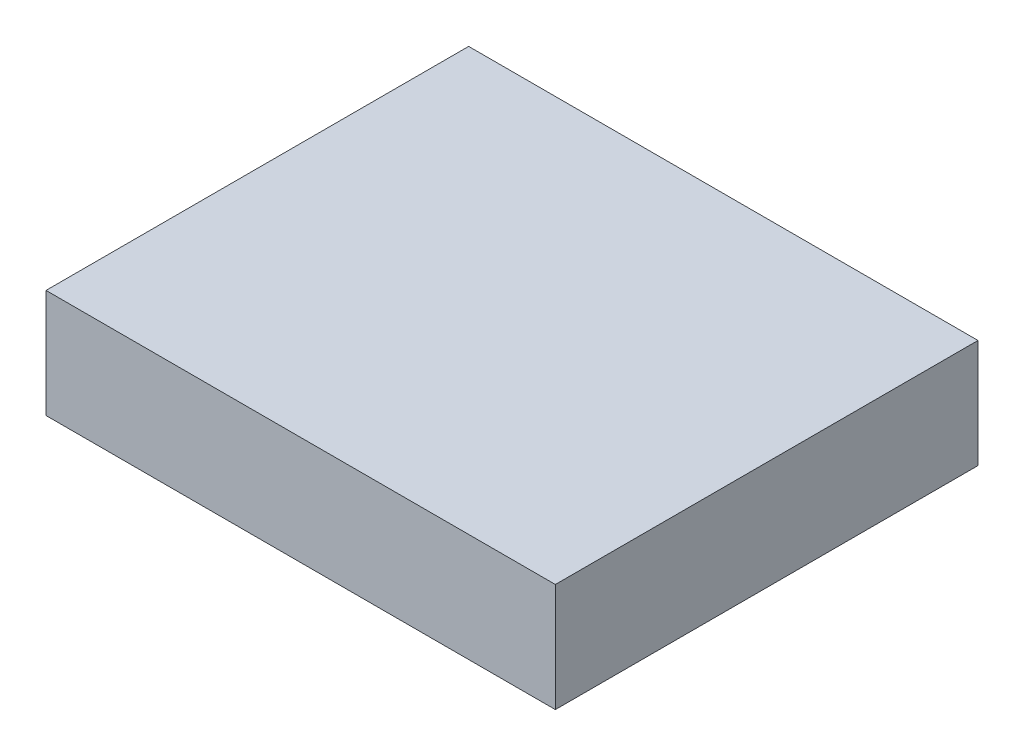
ISO-10303-21;
HEADER;
FILE_DESCRIPTION(('STEP AP214'),'2;1');
FILE_NAME('part.step','',(''),(''),'','','');
FILE_SCHEMA(('AUTOMOTIVE_DESIGN { 1 0 10303 214 1 1 1 1 }'));
ENDSEC;
DATA;
#1=APPLICATION_CONTEXT('core data for automotive mechanical design processes');
#2=APPLICATION_PROTOCOL_DEFINITION('international standard','automotive_design',2000,#1);
#3=PRODUCT_CONTEXT('',#1,'mechanical');
#4=PRODUCT('Part','Part','',(#3));
#5=PRODUCT_RELATED_PRODUCT_CATEGORY('part','',(#4));
#6=PRODUCT_DEFINITION_FORMATION('','',#4);
#7=PRODUCT_DEFINITION_CONTEXT('part definition',#1,'design');
#8=PRODUCT_DEFINITION('design','',#6,#7);
#9=PRODUCT_DEFINITION_SHAPE('','',#8);
#10=(LENGTH_UNIT() NAMED_UNIT(*) SI_UNIT(.MILLI.,.METRE.));
#11=(NAMED_UNIT(*) PLANE_ANGLE_UNIT() SI_UNIT($,.RADIAN.));
#12=(NAMED_UNIT(*) SI_UNIT($,.STERADIAN.) SOLID_ANGLE_UNIT());
#13=UNCERTAINTY_MEASURE_WITH_UNIT(LENGTH_MEASURE(1.E-05),#10,'distance_accuracy_value','');
#14=(GEOMETRIC_REPRESENTATION_CONTEXT(3) GLOBAL_UNCERTAINTY_ASSIGNED_CONTEXT((#13)) GLOBAL_UNIT_ASSIGNED_CONTEXT((#10,
#11,#12)) REPRESENTATION_CONTEXT('',''));
#15=CARTESIAN_POINT('',(0.,0.,0.));
#16=DIRECTION('',(0.,0.,1.));
#17=DIRECTION('',(1.,0.,0.));
#18=AXIS2_PLACEMENT_3D('',#15,#16,#17);
#19=CARTESIAN_POINT('',(0.,10.,0.));
#20=DIRECTION('',(-1.,0.,0.));
#21=DIRECTION('',(0.,0.,1.));
#22=AXIS2_PLACEMENT_3D('',#19,#20,#21);
#23=PLANE('',#22);
#24=DIRECTION('',(0.,0.,-1.));
#25=VECTOR('',#24,1.);
#26=CARTESIAN_POINT('',(0.,0.,0.));
#27=LINE('',#26,#25);
#28=CARTESIAN_POINT('',(0.,0.,0.));
#29=VERTEX_POINT('',#28);
#30=CARTESIAN_POINT('',(0.,0.,-39.));
#31=VERTEX_POINT('',#30);
#32=EDGE_CURVE('E113',#29,#31,#27,.T.);
#33=ORIENTED_EDGE('',*,*,#32,.T.);
#34=DIRECTION('',(0.,-1.,0.));
#35=VECTOR('',#34,1.);
#36=CARTESIAN_POINT('',(0.,10.,-39.));
#37=LINE('',#36,#35);
#38=CARTESIAN_POINT('',(0.,10.,-39.));
#39=VERTEX_POINT('',#38);
#40=EDGE_CURVE('E11',#39,#31,#37,.T.);
#41=ORIENTED_EDGE('',*,*,#40,.F.);
#42=DIRECTION('',(0.,0.,-1.));
#43=VECTOR('',#42,1.);
#44=CARTESIAN_POINT('',(0.,10.,0.));
#45=LINE('',#44,#43);
#46=CARTESIAN_POINT('',(0.,10.,0.));
#47=VERTEX_POINT('',#46);
#48=EDGE_CURVE('E97',#47,#39,#45,.T.);
#49=ORIENTED_EDGE('',*,*,#48,.F.);
#50=DIRECTION('',(0.,-1.,0.));
#51=VECTOR('',#50,1.);
#52=CARTESIAN_POINT('',(0.,10.,0.));
#53=LINE('',#52,#51);
#54=EDGE_CURVE('E109',#47,#29,#53,.T.);
#55=ORIENTED_EDGE('',*,*,#54,.T.);
#56=EDGE_LOOP('',(#33,#41,#49,#55));
#57=FACE_BOUND('',#56,.T.);
#58=ADVANCED_FACE('F45',(#57),#23,.F.);
#59=CARTESIAN_POINT('',(0.,10.,-39.));
#60=DIRECTION('',(0.,0.,1.));
#61=DIRECTION('',(1.,0.,0.));
#62=AXIS2_PLACEMENT_3D('',#59,#60,#61);
#63=PLANE('',#62);
#64=DIRECTION('',(-1.,0.,0.));
#65=VECTOR('',#64,1.);
#66=CARTESIAN_POINT('',(0.,0.,-39.));
#67=LINE('',#66,#65);
#68=CARTESIAN_POINT('',(-47.,0.,-39.));
#69=VERTEX_POINT('',#68);
#70=EDGE_CURVE('E102',#31,#69,#67,.T.);
#71=ORIENTED_EDGE('',*,*,#70,.T.);
#72=DIRECTION('',(0.,-1.,0.));
#73=VECTOR('',#72,1.);
#74=CARTESIAN_POINT('',(-47.,10.,-39.));
#75=LINE('',#74,#73);
#76=CARTESIAN_POINT('',(-47.,10.,-39.));
#77=VERTEX_POINT('',#76);
#78=EDGE_CURVE('E54',#77,#69,#75,.T.);
#79=ORIENTED_EDGE('',*,*,#78,.F.);
#80=DIRECTION('',(-1.,0.,0.));
#81=VECTOR('',#80,1.);
#82=CARTESIAN_POINT('',(0.,10.,-39.));
#83=LINE('',#82,#81);
#84=EDGE_CURVE('E92',#39,#77,#83,.T.);
#85=ORIENTED_EDGE('',*,*,#84,.F.);
#86=ORIENTED_EDGE('',*,*,#40,.T.);
#87=EDGE_LOOP('',(#71,#79,#85,#86));
#88=FACE_BOUND('',#87,.T.);
#89=ADVANCED_FACE('F101',(#88),#63,.F.);
#90=CARTESIAN_POINT('',(-47.,10.,0.));
#91=DIRECTION('',(1.,0.,0.));
#92=DIRECTION('',(0.,0.,-1.));
#93=AXIS2_PLACEMENT_3D('',#90,#91,#92);
#94=PLANE('',#93);
#95=DIRECTION('',(0.,0.,1.));
#96=VECTOR('',#95,1.);
#97=CARTESIAN_POINT('',(-47.,0.,0.));
#98=LINE('',#97,#96);
#99=CARTESIAN_POINT('',(-47.,0.,0.));
#100=VERTEX_POINT('',#99);
#101=EDGE_CURVE('E79',#69,#100,#98,.T.);
#102=ORIENTED_EDGE('',*,*,#101,.T.);
#103=DIRECTION('',(0.,-1.,0.));
#104=VECTOR('',#103,1.);
#105=CARTESIAN_POINT('',(-47.,10.,0.));
#106=LINE('',#105,#104);
#107=CARTESIAN_POINT('',(-47.,10.,0.));
#108=VERTEX_POINT('',#107);
#109=EDGE_CURVE('E104',#108,#100,#106,.T.);
#110=ORIENTED_EDGE('',*,*,#109,.F.);
#111=DIRECTION('',(0.,0.,1.));
#112=VECTOR('',#111,1.);
#113=CARTESIAN_POINT('',(-47.,10.,0.));
#114=LINE('',#113,#112);
#115=EDGE_CURVE('E95',#77,#108,#114,.T.);
#116=ORIENTED_EDGE('',*,*,#115,.F.);
#117=ORIENTED_EDGE('',*,*,#78,.T.);
#118=EDGE_LOOP('',(#102,#110,#116,#117));
#119=FACE_BOUND('',#118,.T.);
#120=ADVANCED_FACE('F105',(#119),#94,.F.);
#121=CARTESIAN_POINT('',(0.,10.,0.));
#122=DIRECTION('',(0.,0.,-1.));
#123=DIRECTION('',(-1.,0.,0.));
#124=AXIS2_PLACEMENT_3D('',#121,#122,#123);
#125=PLANE('',#124);
#126=DIRECTION('',(1.,0.,0.));
#127=VECTOR('',#126,1.);
#128=CARTESIAN_POINT('',(0.,0.,0.));
#129=LINE('',#128,#127);
#130=EDGE_CURVE('E85',#100,#29,#129,.T.);
#131=ORIENTED_EDGE('',*,*,#130,.T.);
#132=ORIENTED_EDGE('',*,*,#54,.F.);
#133=DIRECTION('',(1.,0.,0.));
#134=VECTOR('',#133,1.);
#135=CARTESIAN_POINT('',(0.,10.,0.));
#136=LINE('',#135,#134);
#137=EDGE_CURVE('E62',#108,#47,#136,.T.);
#138=ORIENTED_EDGE('',*,*,#137,.F.);
#139=ORIENTED_EDGE('',*,*,#109,.T.);
#140=EDGE_LOOP('',(#131,#132,#138,#139));
#141=FACE_BOUND('',#140,.T.);
#142=ADVANCED_FACE('F126',(#141),#125,.F.);
#143=CARTESIAN_POINT('',(0.,10.,0.));
#144=DIRECTION('',(0.,1.,0.));
#145=DIRECTION('',(0.,0.,1.));
#146=AXIS2_PLACEMENT_3D('',#143,#144,#145);
#147=PLANE('',#146);
#148=ORIENTED_EDGE('',*,*,#48,.T.);
#149=ORIENTED_EDGE('',*,*,#84,.T.);
#150=ORIENTED_EDGE('',*,*,#115,.T.);
#151=ORIENTED_EDGE('',*,*,#137,.T.);
#152=EDGE_LOOP('',(#148,#149,#150,#151));
#153=FACE_BOUND('',#152,.T.);
#154=ADVANCED_FACE('F93',(#153),#147,.T.);
#155=CARTESIAN_POINT('',(0.,0.,0.));
#156=DIRECTION('',(0.,1.,0.));
#157=DIRECTION('',(0.,0.,1.));
#158=AXIS2_PLACEMENT_3D('',#155,#156,#157);
#159=PLANE('',#158);
#160=ORIENTED_EDGE('',*,*,#32,.F.);
#161=ORIENTED_EDGE('',*,*,#130,.F.);
#162=ORIENTED_EDGE('',*,*,#101,.F.);
#163=ORIENTED_EDGE('',*,*,#70,.F.);
#164=EDGE_LOOP('',(#160,#161,#162,#163));
#165=FACE_BOUND('',#164,.T.);
#166=ADVANCED_FACE('F129',(#165),#159,.F.);
#167=CLOSED_SHELL('',(#58,#89,#120,#142,#154,#166));
#168=MANIFOLD_SOLID_BREP('B2',#167);
#169=ADVANCED_BREP_SHAPE_REPRESENTATION('',(#18,#168),#14);
#170=SHAPE_DEFINITION_REPRESENTATION(#9,#169);
ENDSEC;
END-ISO-10303-21;
